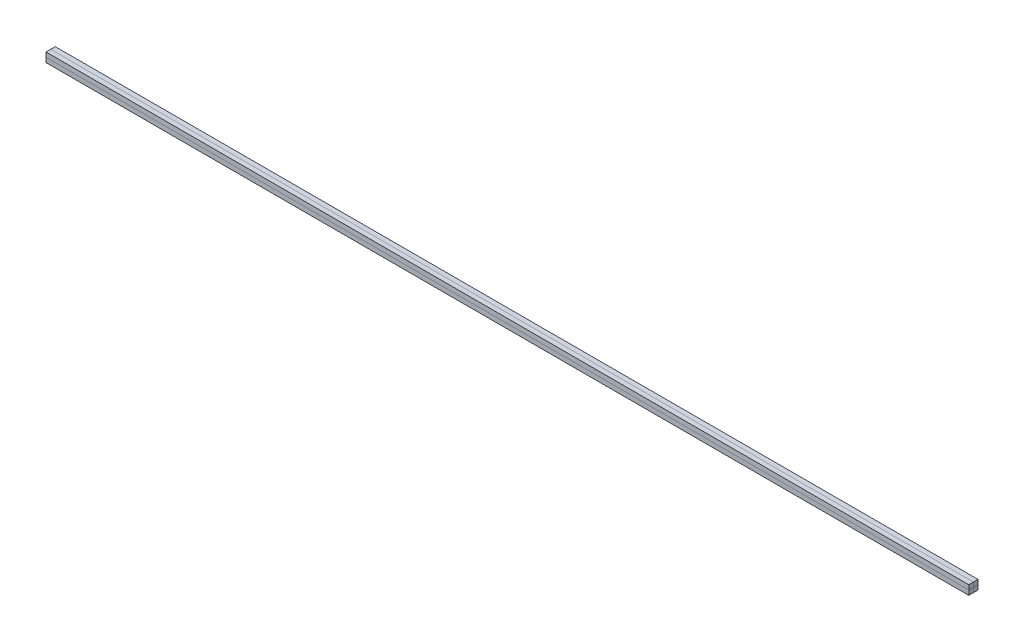
ISO-10303-21;
HEADER;
FILE_DESCRIPTION(('STEP AP214'),'2;1');
FILE_NAME('part.step','',(''),(''),'','','');
FILE_SCHEMA(('AUTOMOTIVE_DESIGN { 1 0 10303 214 1 1 1 1 }'));
ENDSEC;
DATA;
#1=APPLICATION_CONTEXT('core data for automotive mechanical design processes');
#2=APPLICATION_PROTOCOL_DEFINITION('international standard','automotive_design',2000,#1);
#3=PRODUCT_CONTEXT('',#1,'mechanical');
#4=PRODUCT('Part','Part','',(#3));
#5=PRODUCT_RELATED_PRODUCT_CATEGORY('part','',(#4));
#6=PRODUCT_DEFINITION_FORMATION('','',#4);
#7=PRODUCT_DEFINITION_CONTEXT('part definition',#1,'design');
#8=PRODUCT_DEFINITION('design','',#6,#7);
#9=PRODUCT_DEFINITION_SHAPE('','',#8);
#10=(LENGTH_UNIT() NAMED_UNIT(*) SI_UNIT(.MILLI.,.METRE.));
#11=(NAMED_UNIT(*) PLANE_ANGLE_UNIT() SI_UNIT($,.RADIAN.));
#12=(NAMED_UNIT(*) SI_UNIT($,.STERADIAN.) SOLID_ANGLE_UNIT());
#13=UNCERTAINTY_MEASURE_WITH_UNIT(LENGTH_MEASURE(1.E-05),#10,'distance_accuracy_value','');
#14=(GEOMETRIC_REPRESENTATION_CONTEXT(3) GLOBAL_UNCERTAINTY_ASSIGNED_CONTEXT((#13)) GLOBAL_UNIT_ASSIGNED_CONTEXT((#10,
#11,#12)) REPRESENTATION_CONTEXT('',''));
#15=CARTESIAN_POINT('',(0.,0.,0.));
#16=DIRECTION('',(0.,0.,1.));
#17=DIRECTION('',(1.,0.,0.));
#18=AXIS2_PLACEMENT_3D('',#15,#16,#17);
#19=CARTESIAN_POINT('',(0.,0.,0.));
#20=DIRECTION('',(0.,1.,0.));
#21=DIRECTION('',(0.,0.,1.));
#22=AXIS2_PLACEMENT_3D('',#19,#20,#21);
#23=PLANE('',#22);
#24=DIRECTION('',(0.,0.,1.));
#25=VECTOR('',#24,1.);
#26=CARTESIAN_POINT('',(1000.,0.,0.));
#27=LINE('',#26,#25);
#28=CARTESIAN_POINT('',(1000.,0.,-5.));
#29=VERTEX_POINT('',#28);
#30=CARTESIAN_POINT('',(1000.,0.,0.));
#31=VERTEX_POINT('',#30);
#32=EDGE_CURVE('E109',#29,#31,#27,.T.);
#33=ORIENTED_EDGE('',*,*,#32,.F.);
#34=DIRECTION('',(-1.,0.,0.));
#35=VECTOR('',#34,1.);
#36=CARTESIAN_POINT('',(1000.,0.,-5.));
#37=LINE('',#36,#35);
#38=CARTESIAN_POINT('',(0.,0.,-5.));
#39=VERTEX_POINT('',#38);
#40=EDGE_CURVE('E96',#29,#39,#37,.T.);
#41=ORIENTED_EDGE('',*,*,#40,.T.);
#42=DIRECTION('',(0.,0.,1.));
#43=VECTOR('',#42,1.);
#44=CARTESIAN_POINT('',(0.,0.,0.));
#45=LINE('',#44,#43);
#46=CARTESIAN_POINT('',(0.,0.,0.));
#47=VERTEX_POINT('',#46);
#48=EDGE_CURVE('E106',#39,#47,#45,.T.);
#49=ORIENTED_EDGE('',*,*,#48,.T.);
#50=DIRECTION('',(1.,0.,0.));
#51=VECTOR('',#50,1.);
#52=CARTESIAN_POINT('',(0.,0.,0.));
#53=LINE('',#52,#51);
#54=EDGE_CURVE('E59',#47,#31,#53,.T.);
#55=ORIENTED_EDGE('',*,*,#54,.T.);
#56=EDGE_LOOP('',(#33,#41,#49,#55));
#57=FACE_BOUND('',#56,.T.);
#58=ADVANCED_FACE('F55',(#57),#23,.T.);
#59=CARTESIAN_POINT('',(0.,0.,0.));
#60=DIRECTION('',(0.,0.,1.));
#61=DIRECTION('',(1.,0.,0.));
#62=AXIS2_PLACEMENT_3D('',#59,#60,#61);
#63=PLANE('',#62);
#64=DIRECTION('',(0.,-1.,0.));
#65=VECTOR('',#64,1.);
#66=CARTESIAN_POINT('',(1000.,0.,0.));
#67=LINE('',#66,#65);
#68=CARTESIAN_POINT('',(1000.,-5.,0.));
#69=VERTEX_POINT('',#68);
#70=EDGE_CURVE('E122',#31,#69,#67,.T.);
#71=ORIENTED_EDGE('',*,*,#70,.F.);
#72=ORIENTED_EDGE('',*,*,#54,.F.);
#73=DIRECTION('',(0.,-1.,0.));
#74=VECTOR('',#73,1.);
#75=CARTESIAN_POINT('',(0.,0.,0.));
#76=LINE('',#75,#74);
#77=CARTESIAN_POINT('',(0.,-5.,0.));
#78=VERTEX_POINT('',#77);
#79=EDGE_CURVE('E111',#47,#78,#76,.T.);
#80=ORIENTED_EDGE('',*,*,#79,.T.);
#81=DIRECTION('',(1.,0.,0.));
#82=VECTOR('',#81,1.);
#83=CARTESIAN_POINT('',(1000.,-5.,0.));
#84=LINE('',#83,#82);
#85=EDGE_CURVE('E110',#78,#69,#84,.T.);
#86=ORIENTED_EDGE('',*,*,#85,.T.);
#87=EDGE_LOOP('',(#71,#72,#80,#86));
#88=FACE_BOUND('',#87,.T.);
#89=ADVANCED_FACE('F127',(#88),#63,.T.);
#90=CARTESIAN_POINT('',(1000.,-5.,-5.));
#91=DIRECTION('',(0.,1.,0.));
#92=DIRECTION('',(0.,0.,1.));
#93=AXIS2_PLACEMENT_3D('',#90,#91,#92);
#94=PLANE('',#93);
#95=ORIENTED_EDGE('',*,*,#85,.F.);
#96=DIRECTION('',(0.,0.,-1.));
#97=VECTOR('',#96,1.);
#98=CARTESIAN_POINT('',(0.,-5.,-5.));
#99=LINE('',#98,#97);
#100=CARTESIAN_POINT('',(0.,-5.,-5.));
#101=VERTEX_POINT('',#100);
#102=EDGE_CURVE('E12',#78,#101,#99,.T.);
#103=ORIENTED_EDGE('',*,*,#102,.T.);
#104=DIRECTION('',(-1.,0.,0.));
#105=VECTOR('',#104,1.);
#106=CARTESIAN_POINT('',(1000.,-5.,-5.));
#107=LINE('',#106,#105);
#108=CARTESIAN_POINT('',(1000.,-5.,-5.));
#109=VERTEX_POINT('',#108);
#110=EDGE_CURVE('E98',#109,#101,#107,.T.);
#111=ORIENTED_EDGE('',*,*,#110,.F.);
#112=DIRECTION('',(0.,0.,-1.));
#113=VECTOR('',#112,1.);
#114=CARTESIAN_POINT('',(1000.,-5.,-5.));
#115=LINE('',#114,#113);
#116=EDGE_CURVE('E101',#69,#109,#115,.T.);
#117=ORIENTED_EDGE('',*,*,#116,.F.);
#118=EDGE_LOOP('',(#95,#103,#111,#117));
#119=FACE_BOUND('',#118,.T.);
#120=ADVANCED_FACE('F129',(#119),#94,.F.);
#121=CARTESIAN_POINT('',(1000.,-5.,-5.));
#122=DIRECTION('',(0.,0.,1.));
#123=DIRECTION('',(1.,0.,0.));
#124=AXIS2_PLACEMENT_3D('',#121,#122,#123);
#125=PLANE('',#124);
#126=ORIENTED_EDGE('',*,*,#40,.F.);
#127=DIRECTION('',(0.,1.,0.));
#128=VECTOR('',#127,1.);
#129=CARTESIAN_POINT('',(1000.,-5.,-5.));
#130=LINE('',#129,#128);
#131=EDGE_CURVE('E118',#109,#29,#130,.T.);
#132=ORIENTED_EDGE('',*,*,#131,.F.);
#133=ORIENTED_EDGE('',*,*,#110,.T.);
#134=DIRECTION('',(0.,1.,0.));
#135=VECTOR('',#134,1.);
#136=CARTESIAN_POINT('',(0.,-5.,-5.));
#137=LINE('',#136,#135);
#138=EDGE_CURVE('E65',#101,#39,#137,.T.);
#139=ORIENTED_EDGE('',*,*,#138,.T.);
#140=EDGE_LOOP('',(#126,#132,#133,#139));
#141=FACE_BOUND('',#140,.T.);
#142=ADVANCED_FACE('F94',(#141),#125,.F.);
#143=CARTESIAN_POINT('',(0.,0.,0.));
#144=DIRECTION('',(1.,0.,0.));
#145=DIRECTION('',(0.,0.,-1.));
#146=AXIS2_PLACEMENT_3D('',#143,#144,#145);
#147=PLANE('',#146);
#148=ORIENTED_EDGE('',*,*,#79,.F.);
#149=ORIENTED_EDGE('',*,*,#48,.F.);
#150=ORIENTED_EDGE('',*,*,#138,.F.);
#151=ORIENTED_EDGE('',*,*,#102,.F.);
#152=EDGE_LOOP('',(#148,#149,#150,#151));
#153=FACE_BOUND('',#152,.T.);
#154=ADVANCED_FACE('F57',(#153),#147,.F.);
#155=CARTESIAN_POINT('',(1000.,0.,0.));
#156=DIRECTION('',(1.,0.,0.));
#157=DIRECTION('',(0.,0.,-1.));
#158=AXIS2_PLACEMENT_3D('',#155,#156,#157);
#159=PLANE('',#158);
#160=ORIENTED_EDGE('',*,*,#32,.T.);
#161=ORIENTED_EDGE('',*,*,#70,.T.);
#162=ORIENTED_EDGE('',*,*,#116,.T.);
#163=ORIENTED_EDGE('',*,*,#131,.T.);
#164=EDGE_LOOP('',(#160,#161,#162,#163));
#165=FACE_BOUND('',#164,.T.);
#166=ADVANCED_FACE('F125',(#165),#159,.T.);
#167=CLOSED_SHELL('',(#58,#89,#120,#142,#154,#166));
#168=MANIFOLD_SOLID_BREP('B2',#167);
#169=CARTESIAN_POINT('',(0.,0.,0.));
#170=DIRECTION('',(0.,1.,0.));
#171=DIRECTION('',(0.,0.,1.));
#172=AXIS2_PLACEMENT_3D('',#169,#170,#171);
#173=PLANE('',#172);
#174=DIRECTION('',(0.,0.,1.));
#175=VECTOR('',#174,1.);
#176=CARTESIAN_POINT('',(1000.,0.,0.));
#177=LINE('',#176,#175);
#178=CARTESIAN_POINT('',(1000.,0.,0.));
#179=VERTEX_POINT('',#178);
#180=CARTESIAN_POINT('',(1000.,0.,5.));
#181=VERTEX_POINT('',#180);
#182=EDGE_CURVE('E245',#179,#181,#177,.T.);
#183=ORIENTED_EDGE('',*,*,#182,.T.);
#184=DIRECTION('',(1.,0.,0.));
#185=VECTOR('',#184,1.);
#186=CARTESIAN_POINT('',(1000.,0.,5.));
#187=LINE('',#186,#185);
#188=CARTESIAN_POINT('',(0.,0.,5.));
#189=VERTEX_POINT('',#188);
#190=EDGE_CURVE('E234',#189,#181,#187,.T.);
#191=ORIENTED_EDGE('',*,*,#190,.F.);
#192=DIRECTION('',(0.,0.,1.));
#193=VECTOR('',#192,1.);
#194=CARTESIAN_POINT('',(0.,0.,0.));
#195=LINE('',#194,#193);
#196=CARTESIAN_POINT('',(0.,0.,0.));
#197=VERTEX_POINT('',#196);
#198=EDGE_CURVE('E257',#197,#189,#195,.T.);
#199=ORIENTED_EDGE('',*,*,#198,.F.);
#200=DIRECTION('',(1.,0.,0.));
#201=VECTOR('',#200,1.);
#202=CARTESIAN_POINT('',(0.,0.,0.));
#203=LINE('',#202,#201);
#204=EDGE_CURVE('E199',#197,#179,#203,.T.);
#205=ORIENTED_EDGE('',*,*,#204,.T.);
#206=EDGE_LOOP('',(#183,#191,#199,#205));
#207=FACE_BOUND('',#206,.T.);
#208=ADVANCED_FACE('F195',(#207),#173,.F.);
#209=CARTESIAN_POINT('',(0.,0.,0.));
#210=DIRECTION('',(0.,0.,1.));
#211=DIRECTION('',(1.,0.,0.));
#212=AXIS2_PLACEMENT_3D('',#209,#210,#211);
#213=PLANE('',#212);
#214=DIRECTION('',(0.,-1.,0.));
#215=VECTOR('',#214,1.);
#216=CARTESIAN_POINT('',(1000.,0.,0.));
#217=LINE('',#216,#215);
#218=CARTESIAN_POINT('',(1000.,5.,0.));
#219=VERTEX_POINT('',#218);
#220=EDGE_CURVE('E242',#219,#179,#217,.T.);
#221=ORIENTED_EDGE('',*,*,#220,.T.);
#222=ORIENTED_EDGE('',*,*,#204,.F.);
#223=DIRECTION('',(0.,-1.,0.));
#224=VECTOR('',#223,1.);
#225=CARTESIAN_POINT('',(0.,0.,0.));
#226=LINE('',#225,#224);
#227=CARTESIAN_POINT('',(0.,5.,0.));
#228=VERTEX_POINT('',#227);
#229=EDGE_CURVE('E258',#228,#197,#226,.T.);
#230=ORIENTED_EDGE('',*,*,#229,.F.);
#231=DIRECTION('',(-1.,0.,0.));
#232=VECTOR('',#231,1.);
#233=CARTESIAN_POINT('',(1000.,5.,0.));
#234=LINE('',#233,#232);
#235=EDGE_CURVE('E241',#219,#228,#234,.T.);
#236=ORIENTED_EDGE('',*,*,#235,.F.);
#237=EDGE_LOOP('',(#221,#222,#230,#236));
#238=FACE_BOUND('',#237,.T.);
#239=ADVANCED_FACE('F267',(#238),#213,.F.);
#240=CARTESIAN_POINT('',(1000.,-5.,5.));
#241=DIRECTION('',(0.,0.,-1.));
#242=DIRECTION('',(-1.,0.,0.));
#243=AXIS2_PLACEMENT_3D('',#240,#241,#242);
#244=PLANE('',#243);
#245=DIRECTION('',(0.,-1.,0.));
#246=VECTOR('',#245,1.);
#247=CARTESIAN_POINT('',(0.,-5.,5.));
#248=LINE('',#247,#246);
#249=CARTESIAN_POINT('',(0.,5.,5.));
#250=VERTEX_POINT('',#249);
#251=EDGE_CURVE('E53',#250,#189,#248,.T.);
#252=ORIENTED_EDGE('',*,*,#251,.T.);
#253=ORIENTED_EDGE('',*,*,#190,.T.);
#254=DIRECTION('',(0.,-1.,0.));
#255=VECTOR('',#254,1.);
#256=CARTESIAN_POINT('',(1000.,-5.,5.));
#257=LINE('',#256,#255);
#258=CARTESIAN_POINT('',(1000.,5.,5.));
#259=VERTEX_POINT('',#258);
#260=EDGE_CURVE('E238',#259,#181,#257,.T.);
#261=ORIENTED_EDGE('',*,*,#260,.F.);
#262=DIRECTION('',(-1.,0.,0.));
#263=VECTOR('',#262,1.);
#264=CARTESIAN_POINT('',(1000.,5.,5.));
#265=LINE('',#264,#263);
#266=EDGE_CURVE('E255',#259,#250,#265,.T.);
#267=ORIENTED_EDGE('',*,*,#266,.T.);
#268=EDGE_LOOP('',(#252,#253,#261,#267));
#269=FACE_BOUND('',#268,.T.);
#270=ADVANCED_FACE('F236',(#269),#244,.F.);
#271=CARTESIAN_POINT('',(1000.,5.,-5.));
#272=DIRECTION('',(0.,-1.,0.));
#273=DIRECTION('',(0.,0.,-1.));
#274=AXIS2_PLACEMENT_3D('',#271,#272,#273);
#275=PLANE('',#274);
#276=DIRECTION('',(0.,0.,1.));
#277=VECTOR('',#276,1.);
#278=CARTESIAN_POINT('',(1000.,5.,-5.));
#279=LINE('',#278,#277);
#280=EDGE_CURVE('E252',#219,#259,#279,.T.);
#281=ORIENTED_EDGE('',*,*,#280,.F.);
#282=ORIENTED_EDGE('',*,*,#235,.T.);
#283=DIRECTION('',(0.,0.,1.));
#284=VECTOR('',#283,1.);
#285=CARTESIAN_POINT('',(0.,5.,-5.));
#286=LINE('',#285,#284);
#287=EDGE_CURVE('E205',#228,#250,#286,.T.);
#288=ORIENTED_EDGE('',*,*,#287,.T.);
#289=ORIENTED_EDGE('',*,*,#266,.F.);
#290=EDGE_LOOP('',(#281,#282,#288,#289));
#291=FACE_BOUND('',#290,.T.);
#292=ADVANCED_FACE('F268',(#291),#275,.F.);
#293=CARTESIAN_POINT('',(1000.,0.,0.));
#294=DIRECTION('',(1.,0.,0.));
#295=DIRECTION('',(0.,0.,-1.));
#296=AXIS2_PLACEMENT_3D('',#293,#294,#295);
#297=PLANE('',#296);
#298=ORIENTED_EDGE('',*,*,#220,.F.);
#299=ORIENTED_EDGE('',*,*,#280,.T.);
#300=ORIENTED_EDGE('',*,*,#260,.T.);
#301=ORIENTED_EDGE('',*,*,#182,.F.);
#302=EDGE_LOOP('',(#298,#299,#300,#301));
#303=FACE_BOUND('',#302,.T.);
#304=ADVANCED_FACE('F197',(#303),#297,.T.);
#305=CARTESIAN_POINT('',(0.,0.,0.));
#306=DIRECTION('',(1.,0.,0.));
#307=DIRECTION('',(0.,0.,-1.));
#308=AXIS2_PLACEMENT_3D('',#305,#306,#307);
#309=PLANE('',#308);
#310=ORIENTED_EDGE('',*,*,#287,.F.);
#311=ORIENTED_EDGE('',*,*,#229,.T.);
#312=ORIENTED_EDGE('',*,*,#198,.T.);
#313=ORIENTED_EDGE('',*,*,#251,.F.);
#314=EDGE_LOOP('',(#310,#311,#312,#313));
#315=FACE_BOUND('',#314,.T.);
#316=ADVANCED_FACE('F269',(#315),#309,.F.);
#317=CLOSED_SHELL('',(#208,#239,#270,#292,#304,#316));
#318=MANIFOLD_SOLID_BREP('B6',#317);
#319=CARTESIAN_POINT('',(0.,0.,0.));
#320=DIRECTION('',(0.,0.,1.));
#321=DIRECTION('',(1.,0.,0.));
#322=AXIS2_PLACEMENT_3D('',#319,#320,#321);
#323=PLANE('',#322);
#324=DIRECTION('',(0.,-1.,0.));
#325=VECTOR('',#324,1.);
#326=CARTESIAN_POINT('',(1000.,0.,0.));
#327=LINE('',#326,#325);
#328=CARTESIAN_POINT('',(1000.,0.,0.));
#329=VERTEX_POINT('',#328);
#330=CARTESIAN_POINT('',(1000.,-5.,0.));
#331=VERTEX_POINT('',#330);
#332=EDGE_CURVE('E385',#329,#331,#327,.T.);
#333=ORIENTED_EDGE('',*,*,#332,.T.);
#334=DIRECTION('',(1.,0.,0.));
#335=VECTOR('',#334,1.);
#336=CARTESIAN_POINT('',(1000.,-5.,0.));
#337=LINE('',#336,#335);
#338=CARTESIAN_POINT('',(0.,-5.,0.));
#339=VERTEX_POINT('',#338);
#340=EDGE_CURVE('E384',#339,#331,#337,.T.);
#341=ORIENTED_EDGE('',*,*,#340,.F.);
#342=DIRECTION('',(0.,-1.,0.));
#343=VECTOR('',#342,1.);
#344=CARTESIAN_POINT('',(0.,0.,0.));
#345=LINE('',#344,#343);
#346=CARTESIAN_POINT('',(0.,0.,0.));
#347=VERTEX_POINT('',#346);
#348=EDGE_CURVE('E399',#347,#339,#345,.T.);
#349=ORIENTED_EDGE('',*,*,#348,.F.);
#350=DIRECTION('',(1.,0.,0.));
#351=VECTOR('',#350,1.);
#352=CARTESIAN_POINT('',(0.,0.,0.));
#353=LINE('',#352,#351);
#354=EDGE_CURVE('E339',#347,#329,#353,.T.);
#355=ORIENTED_EDGE('',*,*,#354,.T.);
#356=EDGE_LOOP('',(#333,#341,#349,#355));
#357=FACE_BOUND('',#356,.T.);
#358=ADVANCED_FACE('F335',(#357),#323,.F.);
#359=CARTESIAN_POINT('',(0.,0.,0.));
#360=DIRECTION('',(0.,1.,0.));
#361=DIRECTION('',(0.,0.,1.));
#362=AXIS2_PLACEMENT_3D('',#359,#360,#361);
#363=PLANE('',#362);
#364=DIRECTION('',(0.,0.,1.));
#365=VECTOR('',#364,1.);
#366=CARTESIAN_POINT('',(1000.,0.,0.));
#367=LINE('',#366,#365);
#368=CARTESIAN_POINT('',(1000.,0.,5.));
#369=VERTEX_POINT('',#368);
#370=EDGE_CURVE('E401',#329,#369,#367,.T.);
#371=ORIENTED_EDGE('',*,*,#370,.F.);
#372=ORIENTED_EDGE('',*,*,#354,.F.);
#373=DIRECTION('',(0.,0.,1.));
#374=VECTOR('',#373,1.);
#375=CARTESIAN_POINT('',(0.,0.,0.));
#376=LINE('',#375,#374);
#377=CARTESIAN_POINT('',(0.,0.,5.));
#378=VERTEX_POINT('',#377);
#379=EDGE_CURVE('E374',#347,#378,#376,.T.);
#380=ORIENTED_EDGE('',*,*,#379,.T.);
#381=DIRECTION('',(1.,0.,0.));
#382=VECTOR('',#381,1.);
#383=CARTESIAN_POINT('',(1000.,0.,5.));
#384=LINE('',#383,#382);
#385=EDGE_CURVE('E379',#378,#369,#384,.T.);
#386=ORIENTED_EDGE('',*,*,#385,.T.);
#387=EDGE_LOOP('',(#371,#372,#380,#386));
#388=FACE_BOUND('',#387,.T.);
#389=ADVANCED_FACE('F387',(#388),#363,.T.);
#390=CARTESIAN_POINT('',(1000.,-5.,5.));
#391=DIRECTION('',(0.,0.,-1.));
#392=DIRECTION('',(-1.,0.,0.));
#393=AXIS2_PLACEMENT_3D('',#390,#391,#392);
#394=PLANE('',#393);
#395=ORIENTED_EDGE('',*,*,#385,.F.);
#396=DIRECTION('',(0.,-1.,0.));
#397=VECTOR('',#396,1.);
#398=CARTESIAN_POINT('',(0.,-5.,5.));
#399=LINE('',#398,#397);
#400=CARTESIAN_POINT('',(0.,-5.,5.));
#401=VERTEX_POINT('',#400);
#402=EDGE_CURVE('E193',#378,#401,#399,.T.);
#403=ORIENTED_EDGE('',*,*,#402,.T.);
#404=DIRECTION('',(-1.,0.,0.));
#405=VECTOR('',#404,1.);
#406=CARTESIAN_POINT('',(1000.,-5.,5.));
#407=LINE('',#406,#405);
#408=CARTESIAN_POINT('',(1000.,-5.,5.));
#409=VERTEX_POINT('',#408);
#410=EDGE_CURVE('E396',#409,#401,#407,.T.);
#411=ORIENTED_EDGE('',*,*,#410,.F.);
#412=DIRECTION('',(0.,-1.,0.));
#413=VECTOR('',#412,1.);
#414=CARTESIAN_POINT('',(1000.,-5.,5.));
#415=LINE('',#414,#413);
#416=EDGE_CURVE('E381',#369,#409,#415,.T.);
#417=ORIENTED_EDGE('',*,*,#416,.F.);
#418=EDGE_LOOP('',(#395,#403,#411,#417));
#419=FACE_BOUND('',#418,.T.);
#420=ADVANCED_FACE('F380',(#419),#394,.F.);
#421=CARTESIAN_POINT('',(1000.,-5.,-5.));
#422=DIRECTION('',(0.,1.,0.));
#423=DIRECTION('',(0.,0.,1.));
#424=AXIS2_PLACEMENT_3D('',#421,#422,#423);
#425=PLANE('',#424);
#426=DIRECTION('',(0.,0.,-1.));
#427=VECTOR('',#426,1.);
#428=CARTESIAN_POINT('',(0.,-5.,-5.));
#429=LINE('',#428,#427);
#430=EDGE_CURVE('E345',#401,#339,#429,.T.);
#431=ORIENTED_EDGE('',*,*,#430,.T.);
#432=ORIENTED_EDGE('',*,*,#340,.T.);
#433=DIRECTION('',(0.,0.,-1.));
#434=VECTOR('',#433,1.);
#435=CARTESIAN_POINT('',(1000.,-5.,-5.));
#436=LINE('',#435,#434);
#437=EDGE_CURVE('E392',#409,#331,#436,.T.);
#438=ORIENTED_EDGE('',*,*,#437,.F.);
#439=ORIENTED_EDGE('',*,*,#410,.T.);
#440=EDGE_LOOP('',(#431,#432,#438,#439));
#441=FACE_BOUND('',#440,.T.);
#442=ADVANCED_FACE('F409',(#441),#425,.F.);
#443=CARTESIAN_POINT('',(0.,0.,0.));
#444=DIRECTION('',(1.,0.,0.));
#445=DIRECTION('',(0.,0.,-1.));
#446=AXIS2_PLACEMENT_3D('',#443,#444,#445);
#447=PLANE('',#446);
#448=ORIENTED_EDGE('',*,*,#379,.F.);
#449=ORIENTED_EDGE('',*,*,#348,.T.);
#450=ORIENTED_EDGE('',*,*,#430,.F.);
#451=ORIENTED_EDGE('',*,*,#402,.F.);
#452=EDGE_LOOP('',(#448,#449,#450,#451));
#453=FACE_BOUND('',#452,.T.);
#454=ADVANCED_FACE('F372',(#453),#447,.F.);
#455=CARTESIAN_POINT('',(1000.,0.,0.));
#456=DIRECTION('',(1.,0.,0.));
#457=DIRECTION('',(0.,0.,-1.));
#458=AXIS2_PLACEMENT_3D('',#455,#456,#457);
#459=PLANE('',#458);
#460=ORIENTED_EDGE('',*,*,#332,.F.);
#461=ORIENTED_EDGE('',*,*,#370,.T.);
#462=ORIENTED_EDGE('',*,*,#416,.T.);
#463=ORIENTED_EDGE('',*,*,#437,.T.);
#464=EDGE_LOOP('',(#460,#461,#462,#463));
#465=FACE_BOUND('',#464,.T.);
#466=ADVANCED_FACE('F337',(#465),#459,.T.);
#467=CLOSED_SHELL('',(#358,#389,#420,#442,#454,#466));
#468=MANIFOLD_SOLID_BREP('B47',#467);
#469=CARTESIAN_POINT('',(0.,0.,0.));
#470=DIRECTION('',(0.,1.,0.));
#471=DIRECTION('',(0.,0.,1.));
#472=AXIS2_PLACEMENT_3D('',#469,#470,#471);
#473=PLANE('',#472);
#474=DIRECTION('',(0.,0.,1.));
#475=VECTOR('',#474,1.);
#476=CARTESIAN_POINT('',(1000.,0.,0.));
#477=LINE('',#476,#475);
#478=CARTESIAN_POINT('',(1000.,0.,-5.));
#479=VERTEX_POINT('',#478);
#480=CARTESIAN_POINT('',(1000.,0.,0.));
#481=VERTEX_POINT('',#480);
#482=EDGE_CURVE('E476',#479,#481,#477,.T.);
#483=ORIENTED_EDGE('',*,*,#482,.T.);
#484=DIRECTION('',(1.,0.,0.));
#485=VECTOR('',#484,1.);
#486=CARTESIAN_POINT('',(0.,0.,0.));
#487=LINE('',#486,#485);
#488=CARTESIAN_POINT('',(0.,0.,0.));
#489=VERTEX_POINT('',#488);
#490=EDGE_CURVE('E537',#489,#481,#487,.T.);
#491=ORIENTED_EDGE('',*,*,#490,.F.);
#492=DIRECTION('',(0.,0.,1.));
#493=VECTOR('',#492,1.);
#494=CARTESIAN_POINT('',(0.,0.,0.));
#495=LINE('',#494,#493);
#496=CARTESIAN_POINT('',(0.,0.,-5.));
#497=VERTEX_POINT('',#496);
#498=EDGE_CURVE('E492',#497,#489,#495,.T.);
#499=ORIENTED_EDGE('',*,*,#498,.F.);
#500=DIRECTION('',(-1.,0.,0.));
#501=VECTOR('',#500,1.);
#502=CARTESIAN_POINT('',(1000.,0.,-5.));
#503=LINE('',#502,#501);
#504=EDGE_CURVE('E546',#479,#497,#503,.T.);
#505=ORIENTED_EDGE('',*,*,#504,.F.);
#506=EDGE_LOOP('',(#483,#491,#499,#505));
#507=FACE_BOUND('',#506,.T.);
#508=ADVANCED_FACE('F466',(#507),#473,.F.);
#509=CARTESIAN_POINT('',(0.,0.,0.));
#510=DIRECTION('',(0.,0.,1.));
#511=DIRECTION('',(1.,0.,0.));
#512=AXIS2_PLACEMENT_3D('',#509,#510,#511);
#513=PLANE('',#512);
#514=DIRECTION('',(0.,-1.,0.));
#515=VECTOR('',#514,1.);
#516=CARTESIAN_POINT('',(1000.,0.,0.));
#517=LINE('',#516,#515);
#518=CARTESIAN_POINT('',(1000.,5.,0.));
#519=VERTEX_POINT('',#518);
#520=EDGE_CURVE('E470',#519,#481,#517,.T.);
#521=ORIENTED_EDGE('',*,*,#520,.F.);
#522=DIRECTION('',(-1.,0.,0.));
#523=VECTOR('',#522,1.);
#524=CARTESIAN_POINT('',(1000.,5.,0.));
#525=LINE('',#524,#523);
#526=CARTESIAN_POINT('',(0.,5.,0.));
#527=VERTEX_POINT('',#526);
#528=EDGE_CURVE('E531',#519,#527,#525,.T.);
#529=ORIENTED_EDGE('',*,*,#528,.T.);
#530=DIRECTION('',(0.,-1.,0.));
#531=VECTOR('',#530,1.);
#532=CARTESIAN_POINT('',(0.,0.,0.));
#533=LINE('',#532,#531);
#534=EDGE_CURVE('E333',#527,#489,#533,.T.);
#535=ORIENTED_EDGE('',*,*,#534,.T.);
#536=ORIENTED_EDGE('',*,*,#490,.T.);
#537=EDGE_LOOP('',(#521,#529,#535,#536));
#538=FACE_BOUND('',#537,.T.);
#539=ADVANCED_FACE('F468',(#538),#513,.T.);
#540=CARTESIAN_POINT('',(1000.,-5.,-5.));
#541=DIRECTION('',(0.,0.,1.));
#542=DIRECTION('',(1.,0.,0.));
#543=AXIS2_PLACEMENT_3D('',#540,#541,#542);
#544=PLANE('',#543);
#545=DIRECTION('',(0.,1.,0.));
#546=VECTOR('',#545,1.);
#547=CARTESIAN_POINT('',(1000.,-5.,-5.));
#548=LINE('',#547,#546);
#549=CARTESIAN_POINT('',(1000.,5.,-5.));
#550=VERTEX_POINT('',#549);
#551=EDGE_CURVE('E515',#479,#550,#548,.T.);
#552=ORIENTED_EDGE('',*,*,#551,.F.);
#553=ORIENTED_EDGE('',*,*,#504,.T.);
#554=DIRECTION('',(0.,1.,0.));
#555=VECTOR('',#554,1.);
#556=CARTESIAN_POINT('',(0.,-5.,-5.));
#557=LINE('',#556,#555);
#558=CARTESIAN_POINT('',(0.,5.,-5.));
#559=VERTEX_POINT('',#558);
#560=EDGE_CURVE('E527',#497,#559,#557,.T.);
#561=ORIENTED_EDGE('',*,*,#560,.T.);
#562=DIRECTION('',(-1.,0.,0.));
#563=VECTOR('',#562,1.);
#564=CARTESIAN_POINT('',(1000.,5.,-5.));
#565=LINE('',#564,#563);
#566=EDGE_CURVE('E525',#550,#559,#565,.T.);
#567=ORIENTED_EDGE('',*,*,#566,.F.);
#568=EDGE_LOOP('',(#552,#553,#561,#567));
#569=FACE_BOUND('',#568,.T.);
#570=ADVANCED_FACE('F526',(#569),#544,.F.);
#571=CARTESIAN_POINT('',(1000.,5.,-5.));
#572=DIRECTION('',(0.,-1.,0.));
#573=DIRECTION('',(0.,0.,-1.));
#574=AXIS2_PLACEMENT_3D('',#571,#572,#573);
#575=PLANE('',#574);
#576=ORIENTED_EDGE('',*,*,#528,.F.);
#577=DIRECTION('',(0.,0.,1.));
#578=VECTOR('',#577,1.);
#579=CARTESIAN_POINT('',(1000.,5.,-5.));
#580=LINE('',#579,#578);
#581=EDGE_CURVE('E520',#550,#519,#580,.T.);
#582=ORIENTED_EDGE('',*,*,#581,.F.);
#583=ORIENTED_EDGE('',*,*,#566,.T.);
#584=DIRECTION('',(0.,0.,1.));
#585=VECTOR('',#584,1.);
#586=CARTESIAN_POINT('',(0.,5.,-5.));
#587=LINE('',#586,#585);
#588=EDGE_CURVE('E484',#559,#527,#587,.T.);
#589=ORIENTED_EDGE('',*,*,#588,.T.);
#590=EDGE_LOOP('',(#576,#582,#583,#589));
#591=FACE_BOUND('',#590,.T.);
#592=ADVANCED_FACE('F530',(#591),#575,.F.);
#593=CARTESIAN_POINT('',(0.,0.,0.));
#594=DIRECTION('',(1.,0.,0.));
#595=DIRECTION('',(0.,0.,-1.));
#596=AXIS2_PLACEMENT_3D('',#593,#594,#595);
#597=PLANE('',#596);
#598=ORIENTED_EDGE('',*,*,#534,.F.);
#599=ORIENTED_EDGE('',*,*,#588,.F.);
#600=ORIENTED_EDGE('',*,*,#560,.F.);
#601=ORIENTED_EDGE('',*,*,#498,.T.);
#602=EDGE_LOOP('',(#598,#599,#600,#601));
#603=FACE_BOUND('',#602,.T.);
#604=ADVANCED_FACE('F552',(#603),#597,.F.);
#605=CARTESIAN_POINT('',(1000.,0.,0.));
#606=DIRECTION('',(1.,0.,0.));
#607=DIRECTION('',(0.,0.,-1.));
#608=AXIS2_PLACEMENT_3D('',#605,#606,#607);
#609=PLANE('',#608);
#610=ORIENTED_EDGE('',*,*,#581,.T.);
#611=ORIENTED_EDGE('',*,*,#520,.T.);
#612=ORIENTED_EDGE('',*,*,#482,.F.);
#613=ORIENTED_EDGE('',*,*,#551,.T.);
#614=EDGE_LOOP('',(#610,#611,#612,#613));
#615=FACE_BOUND('',#614,.T.);
#616=ADVANCED_FACE('F517',(#615),#609,.T.);
#617=CLOSED_SHELL('',(#508,#539,#570,#592,#604,#616));
#618=MANIFOLD_SOLID_BREP('B187',#617);
#619=ADVANCED_BREP_SHAPE_REPRESENTATION('',(#18,#168,#318,#468,#618),#14);
#620=SHAPE_DEFINITION_REPRESENTATION(#9,#619);
ENDSEC;
END-ISO-10303-21;
